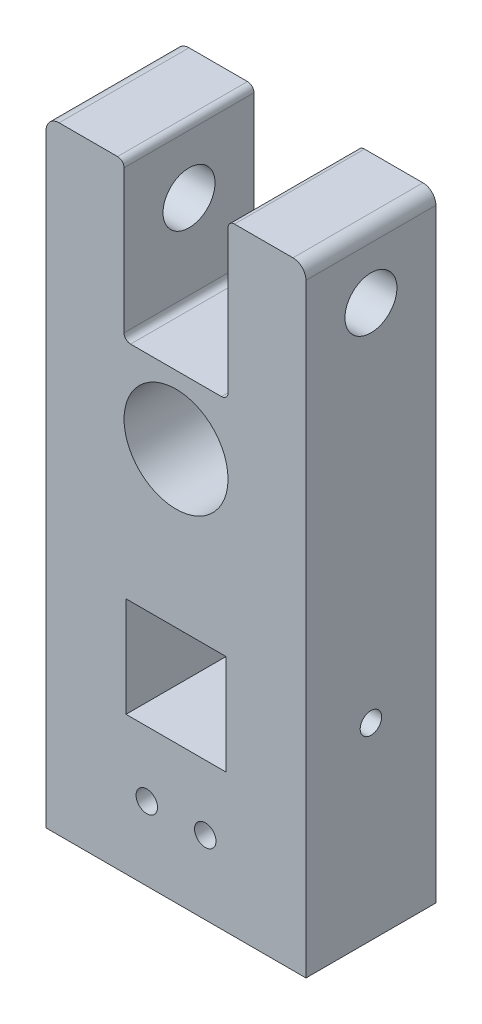
ISO-10303-21;
HEADER;
FILE_DESCRIPTION(('STEP AP214'),'2;1');
FILE_NAME('part.step','',(''),(''),'','','');
FILE_SCHEMA(('AUTOMOTIVE_DESIGN { 1 0 10303 214 1 1 1 1 }'));
ENDSEC;
DATA;
#1=APPLICATION_CONTEXT('core data for automotive mechanical design processes');
#2=APPLICATION_PROTOCOL_DEFINITION('international standard','automotive_design',2000,#1);
#3=PRODUCT_CONTEXT('',#1,'mechanical');
#4=PRODUCT('Part','Part','',(#3));
#5=PRODUCT_RELATED_PRODUCT_CATEGORY('part','',(#4));
#6=PRODUCT_DEFINITION_FORMATION('','',#4);
#7=PRODUCT_DEFINITION_CONTEXT('part definition',#1,'design');
#8=PRODUCT_DEFINITION('design','',#6,#7);
#9=PRODUCT_DEFINITION_SHAPE('','',#8);
#10=(LENGTH_UNIT() NAMED_UNIT(*) SI_UNIT(.MILLI.,.METRE.));
#11=(NAMED_UNIT(*) PLANE_ANGLE_UNIT() SI_UNIT($,.RADIAN.));
#12=(NAMED_UNIT(*) SI_UNIT($,.STERADIAN.) SOLID_ANGLE_UNIT());
#13=UNCERTAINTY_MEASURE_WITH_UNIT(LENGTH_MEASURE(1.E-05),#10,'distance_accuracy_value','');
#14=(GEOMETRIC_REPRESENTATION_CONTEXT(3) GLOBAL_UNCERTAINTY_ASSIGNED_CONTEXT((#13)) GLOBAL_UNIT_ASSIGNED_CONTEXT((#10,
#11,#12)) REPRESENTATION_CONTEXT('',''));
#15=CARTESIAN_POINT('',(0.,0.,0.));
#16=DIRECTION('',(0.,0.,1.));
#17=DIRECTION('',(1.,0.,0.));
#18=AXIS2_PLACEMENT_3D('',#15,#16,#17);
#19=CARTESIAN_POINT('',(-20.,34.5,20.));
#20=DIRECTION('',(0.,-1.,0.));
#21=DIRECTION('',(0.,0.,-1.));
#22=AXIS2_PLACEMENT_3D('',#19,#20,#21);
#23=PLANE('',#22);
#24=DIRECTION('',(-1.,0.,0.));
#25=VECTOR('',#24,1.);
#26=CARTESIAN_POINT('',(-20.,34.5,20.));
#27=LINE('',#26,#25);
#28=CARTESIAN_POINT('',(-8.99999999999999,34.5,20.));
#29=VERTEX_POINT('',#28);
#30=CARTESIAN_POINT('',(-18.,34.5,20.));
#31=VERTEX_POINT('',#30);
#32=EDGE_CURVE('E318',#29,#31,#27,.T.);
#33=ORIENTED_EDGE('',*,*,#32,.F.);
#34=DIRECTION('',(0.,0.,1.));
#35=VECTOR('',#34,1.);
#36=CARTESIAN_POINT('',(-8.99999999999999,34.5,20.));
#37=LINE('',#36,#35);
#38=CARTESIAN_POINT('',(-8.99999999999999,34.5,0.));
#39=VERTEX_POINT('',#38);
#40=EDGE_CURVE('E433',#29,#39,#37,.F.);
#41=ORIENTED_EDGE('',*,*,#40,.T.);
#42=DIRECTION('',(-1.,0.,0.));
#43=VECTOR('',#42,1.);
#44=CARTESIAN_POINT('',(-20.,34.5,0.));
#45=LINE('',#44,#43);
#46=CARTESIAN_POINT('',(-18.,34.5,0.));
#47=VERTEX_POINT('',#46);
#48=EDGE_CURVE('E331',#39,#47,#45,.T.);
#49=ORIENTED_EDGE('',*,*,#48,.T.);
#50=DIRECTION('',(0.,0.,-1.));
#51=VECTOR('',#50,1.);
#52=CARTESIAN_POINT('',(-18.,34.5,20.));
#53=LINE('',#52,#51);
#54=EDGE_CURVE('E355',#47,#31,#53,.F.);
#55=ORIENTED_EDGE('',*,*,#54,.T.);
#56=EDGE_LOOP('',(#33,#41,#49,#55));
#57=FACE_BOUND('',#56,.T.);
#58=ADVANCED_FACE('F44',(#57),#23,.F.);
#59=CARTESIAN_POINT('',(0.,0.,20.));
#60=DIRECTION('',(0.,0.,-1.));
#61=DIRECTION('',(-1.,0.,0.));
#62=AXIS2_PLACEMENT_3D('',#59,#60,#61);
#63=PLANE('',#62);
#64=CARTESIAN_POINT('',(0.,0.,20.));
#65=DIRECTION('',(0.,0.,1.));
#66=DIRECTION('',(1.,0.,0.));
#67=AXIS2_PLACEMENT_3D('',#64,#65,#66);
#68=CIRCLE('',#67,8.);
#69=CARTESIAN_POINT('',(8.,0.,20.));
#70=VERTEX_POINT('',#69);
#71=EDGE_CURVE('E310',#70,#70,#68,.T.);
#72=ORIENTED_EDGE('',*,*,#71,.F.);
#73=EDGE_LOOP('',(#72));
#74=FACE_BOUND('',#73,.T.);
#75=DIRECTION('',(-1.,0.,0.));
#76=VECTOR('',#75,1.);
#77=CARTESIAN_POINT('',(-7.69999999999999,-23.8,20.));
#78=LINE('',#77,#76);
#79=CARTESIAN_POINT('',(7.70000000000001,-23.8,20.));
#80=VERTEX_POINT('',#79);
#81=CARTESIAN_POINT('',(-7.69999999999999,-23.8,20.));
#82=VERTEX_POINT('',#81);
#83=EDGE_CURVE('E263',#80,#82,#78,.T.);
#84=ORIENTED_EDGE('',*,*,#83,.F.);
#85=DIRECTION('',(0.,1.,0.));
#86=VECTOR('',#85,1.);
#87=CARTESIAN_POINT('',(7.70000000000001,-39.2,20.));
#88=LINE('',#87,#86);
#89=CARTESIAN_POINT('',(7.70000000000001,-39.2,20.));
#90=VERTEX_POINT('',#89);
#91=EDGE_CURVE('E265',#90,#80,#88,.T.);
#92=ORIENTED_EDGE('',*,*,#91,.F.);
#93=DIRECTION('',(1.,0.,0.));
#94=VECTOR('',#93,1.);
#95=CARTESIAN_POINT('',(-7.69999999999999,-39.2,20.));
#96=LINE('',#95,#94);
#97=CARTESIAN_POINT('',(-7.69999999999999,-39.2,20.));
#98=VERTEX_POINT('',#97);
#99=EDGE_CURVE('E274',#98,#90,#96,.T.);
#100=ORIENTED_EDGE('',*,*,#99,.F.);
#101=DIRECTION('',(0.,-1.,0.));
#102=VECTOR('',#101,1.);
#103=CARTESIAN_POINT('',(-7.69999999999999,-39.2,20.));
#104=LINE('',#103,#102);
#105=EDGE_CURVE('E267',#82,#98,#104,.T.);
#106=ORIENTED_EDGE('',*,*,#105,.F.);
#107=EDGE_LOOP('',(#84,#92,#100,#106));
#108=FACE_BOUND('',#107,.T.);
#109=CARTESIAN_POINT('',(-4.49999999999999,-49.2,20.));
#110=DIRECTION('',(0.,0.,1.));
#111=DIRECTION('',(1.,0.,0.));
#112=AXIS2_PLACEMENT_3D('',#109,#110,#111);
#113=CIRCLE('',#112,1.65);
#114=CARTESIAN_POINT('',(-2.84999999999999,-49.2,20.));
#115=VERTEX_POINT('',#114);
#116=EDGE_CURVE('E247',#115,#115,#113,.T.);
#117=ORIENTED_EDGE('',*,*,#116,.F.);
#118=EDGE_LOOP('',(#117));
#119=FACE_BOUND('',#118,.T.);
#120=CARTESIAN_POINT('',(4.50000000000001,-49.2,20.));
#121=DIRECTION('',(0.,0.,1.));
#122=DIRECTION('',(1.,0.,0.));
#123=AXIS2_PLACEMENT_3D('',#120,#121,#122);
#124=CIRCLE('',#123,1.65);
#125=CARTESIAN_POINT('',(6.15000000000001,-49.2,20.));
#126=VERTEX_POINT('',#125);
#127=EDGE_CURVE('E251',#126,#126,#124,.T.);
#128=ORIENTED_EDGE('',*,*,#127,.F.);
#129=EDGE_LOOP('',(#128));
#130=FACE_BOUND('',#129,.T.);
#131=CARTESIAN_POINT('',(18.,34.5,20.));
#132=VERTEX_POINT('',#131);
#133=CARTESIAN_POINT('',(9.00000000000001,34.5,20.));
#134=VERTEX_POINT('',#133);
#135=EDGE_CURVE('E325',#132,#134,#27,.T.);
#136=ORIENTED_EDGE('',*,*,#135,.T.);
#137=CARTESIAN_POINT('',(9.00000000000001,33.5,20.));
#138=DIRECTION('',(0.,0.,-1.));
#139=DIRECTION('',(-1.,0.,0.));
#140=AXIS2_PLACEMENT_3D('',#137,#138,#139);
#141=CIRCLE('',#140,1.);
#142=CARTESIAN_POINT('',(8.00000000000001,33.5,20.));
#143=VERTEX_POINT('',#142);
#144=EDGE_CURVE('E407',#134,#143,#141,.F.);
#145=ORIENTED_EDGE('',*,*,#144,.T.);
#146=DIRECTION('',(0.,1.,0.));
#147=VECTOR('',#146,1.);
#148=CARTESIAN_POINT('',(8.00000000000001,10.5,20.));
#149=LINE('',#148,#147);
#150=CARTESIAN_POINT('',(8.00000000000001,11.5,20.));
#151=VERTEX_POINT('',#150);
#152=EDGE_CURVE('E465',#151,#143,#149,.T.);
#153=ORIENTED_EDGE('',*,*,#152,.F.);
#154=CARTESIAN_POINT('',(7.00000000000001,11.5,20.));
#155=DIRECTION('',(0.,0.,-1.));
#156=DIRECTION('',(-1.,0.,0.));
#157=AXIS2_PLACEMENT_3D('',#154,#155,#156);
#158=CIRCLE('',#157,1.);
#159=CARTESIAN_POINT('',(7.00000000000001,10.5,20.));
#160=VERTEX_POINT('',#159);
#161=EDGE_CURVE('E445',#151,#160,#158,.T.);
#162=ORIENTED_EDGE('',*,*,#161,.T.);
#163=DIRECTION('',(1.,0.,0.));
#164=VECTOR('',#163,1.);
#165=CARTESIAN_POINT('',(-7.99999999999999,10.5,20.));
#166=LINE('',#165,#164);
#167=CARTESIAN_POINT('',(-6.99999999999999,10.5,20.));
#168=VERTEX_POINT('',#167);
#169=EDGE_CURVE('E229',#168,#160,#166,.T.);
#170=ORIENTED_EDGE('',*,*,#169,.F.);
#171=CARTESIAN_POINT('',(-6.99999999999999,11.5,20.));
#172=DIRECTION('',(0.,0.,-1.));
#173=DIRECTION('',(-1.,0.,0.));
#174=AXIS2_PLACEMENT_3D('',#171,#172,#173);
#175=CIRCLE('',#174,1.);
#176=CARTESIAN_POINT('',(-7.99999999999999,11.5,20.));
#177=VERTEX_POINT('',#176);
#178=EDGE_CURVE('E54',#168,#177,#175,.T.);
#179=ORIENTED_EDGE('',*,*,#178,.T.);
#180=DIRECTION('',(0.,-1.,0.));
#181=VECTOR('',#180,1.);
#182=CARTESIAN_POINT('',(-7.99999999999999,10.5,20.));
#183=LINE('',#182,#181);
#184=CARTESIAN_POINT('',(-7.99999999999999,33.5,20.));
#185=VERTEX_POINT('',#184);
#186=EDGE_CURVE('E454',#185,#177,#183,.T.);
#187=ORIENTED_EDGE('',*,*,#186,.F.);
#188=CARTESIAN_POINT('',(-8.99999999999999,33.5,20.));
#189=DIRECTION('',(0.,0.,-1.));
#190=DIRECTION('',(-1.,0.,0.));
#191=AXIS2_PLACEMENT_3D('',#188,#189,#190);
#192=CIRCLE('',#191,1.);
#193=EDGE_CURVE('E410',#185,#29,#192,.F.);
#194=ORIENTED_EDGE('',*,*,#193,.T.);
#195=ORIENTED_EDGE('',*,*,#32,.T.);
#196=CARTESIAN_POINT('',(-18.,32.5,20.));
#197=DIRECTION('',(0.,0.,-1.));
#198=DIRECTION('',(-1.,0.,0.));
#199=AXIS2_PLACEMENT_3D('',#196,#197,#198);
#200=CIRCLE('',#199,2.);
#201=CARTESIAN_POINT('',(-20.,32.5,20.));
#202=VERTEX_POINT('',#201);
#203=EDGE_CURVE('E376',#31,#202,#200,.F.);
#204=ORIENTED_EDGE('',*,*,#203,.T.);
#205=DIRECTION('',(0.,-1.,0.));
#206=VECTOR('',#205,1.);
#207=CARTESIAN_POINT('',(-20.,-34.5,20.));
#208=LINE('',#207,#206);
#209=CARTESIAN_POINT('',(-20.,-60.5,20.));
#210=VERTEX_POINT('',#209);
#211=EDGE_CURVE('E327',#202,#210,#208,.T.);
#212=ORIENTED_EDGE('',*,*,#211,.T.);
#213=DIRECTION('',(-1.,0.,0.));
#214=VECTOR('',#213,1.);
#215=CARTESIAN_POINT('',(-20.,-60.5,20.));
#216=LINE('',#215,#214);
#217=CARTESIAN_POINT('',(20.,-60.5,20.));
#218=VERTEX_POINT('',#217);
#219=EDGE_CURVE('E294',#218,#210,#216,.T.);
#220=ORIENTED_EDGE('',*,*,#219,.F.);
#221=DIRECTION('',(0.,1.,0.));
#222=VECTOR('',#221,1.);
#223=CARTESIAN_POINT('',(20.,-34.5,20.));
#224=LINE('',#223,#222);
#225=CARTESIAN_POINT('',(20.,32.5,20.));
#226=VERTEX_POINT('',#225);
#227=EDGE_CURVE('E317',#218,#226,#224,.T.);
#228=ORIENTED_EDGE('',*,*,#227,.T.);
#229=CARTESIAN_POINT('',(18.,32.5,20.));
#230=DIRECTION('',(0.,0.,-1.));
#231=DIRECTION('',(-1.,0.,0.));
#232=AXIS2_PLACEMENT_3D('',#229,#230,#231);
#233=CIRCLE('',#232,2.);
#234=EDGE_CURVE('E378',#226,#132,#233,.F.);
#235=ORIENTED_EDGE('',*,*,#234,.T.);
#236=EDGE_LOOP('',(#136,#145,#153,#162,#170,#179,#187,#194,#195,#204,#212,#220,#228,#235));
#237=FACE_BOUND('',#236,.T.);
#238=ADVANCED_FACE('F451',(#74,#108,#119,#130,#237),#63,.F.);
#239=CARTESIAN_POINT('',(20.,-34.5,20.));
#240=DIRECTION('',(-1.,0.,0.));
#241=DIRECTION('',(0.,0.,1.));
#242=AXIS2_PLACEMENT_3D('',#239,#240,#241);
#243=PLANE('',#242);
#244=CARTESIAN_POINT('',(20.,-31.5,10.));
#245=DIRECTION('',(1.,0.,0.));
#246=DIRECTION('',(0.,0.,-1.));
#247=AXIS2_PLACEMENT_3D('',#244,#245,#246);
#248=CIRCLE('',#247,1.65);
#249=CARTESIAN_POINT('',(20.,-31.5,8.35));
#250=VERTEX_POINT('',#249);
#251=EDGE_CURVE('E500',#250,#250,#248,.T.);
#252=ORIENTED_EDGE('',*,*,#251,.F.);
#253=EDGE_LOOP('',(#252));
#254=FACE_BOUND('',#253,.T.);
#255=CARTESIAN_POINT('',(20.,24.5,10.));
#256=DIRECTION('',(1.,0.,0.));
#257=DIRECTION('',(0.,0.,-1.));
#258=AXIS2_PLACEMENT_3D('',#255,#256,#257);
#259=CIRCLE('',#258,4.);
#260=CARTESIAN_POINT('',(20.,24.5,6.));
#261=VERTEX_POINT('',#260);
#262=EDGE_CURVE('E401',#261,#261,#259,.T.);
#263=ORIENTED_EDGE('',*,*,#262,.F.);
#264=EDGE_LOOP('',(#263));
#265=FACE_BOUND('',#264,.T.);
#266=DIRECTION('',(0.,1.,0.));
#267=VECTOR('',#266,1.);
#268=CARTESIAN_POINT('',(20.,-34.5,0.));
#269=LINE('',#268,#267);
#270=CARTESIAN_POINT('',(20.,-60.5,0.));
#271=VERTEX_POINT('',#270);
#272=CARTESIAN_POINT('',(20.,32.5,0.));
#273=VERTEX_POINT('',#272);
#274=EDGE_CURVE('E315',#271,#273,#269,.T.);
#275=ORIENTED_EDGE('',*,*,#274,.T.);
#276=DIRECTION('',(0.,0.,-1.));
#277=VECTOR('',#276,1.);
#278=CARTESIAN_POINT('',(20.,32.5,20.));
#279=LINE('',#278,#277);
#280=EDGE_CURVE('E373',#273,#226,#279,.F.);
#281=ORIENTED_EDGE('',*,*,#280,.T.);
#282=ORIENTED_EDGE('',*,*,#227,.F.);
#283=DIRECTION('',(0.,0.,1.));
#284=VECTOR('',#283,1.);
#285=CARTESIAN_POINT('',(20.,-60.5,0.));
#286=LINE('',#285,#284);
#287=EDGE_CURVE('E285',#271,#218,#286,.T.);
#288=ORIENTED_EDGE('',*,*,#287,.F.);
#289=EDGE_LOOP('',(#275,#281,#282,#288));
#290=FACE_BOUND('',#289,.T.);
#291=ADVANCED_FACE('F575',(#254,#265,#290),#243,.F.);
#292=CARTESIAN_POINT('',(18.,34.5,0.));
#293=VERTEX_POINT('',#292);
#294=CARTESIAN_POINT('',(9.00000000000001,34.5,0.));
#295=VERTEX_POINT('',#294);
#296=EDGE_CURVE('E334',#293,#295,#45,.T.);
#297=ORIENTED_EDGE('',*,*,#296,.T.);
#298=DIRECTION('',(0.,0.,1.));
#299=VECTOR('',#298,1.);
#300=CARTESIAN_POINT('',(9.00000000000001,34.5,20.));
#301=LINE('',#300,#299);
#302=EDGE_CURVE('E400',#295,#134,#301,.T.);
#303=ORIENTED_EDGE('',*,*,#302,.T.);
#304=ORIENTED_EDGE('',*,*,#135,.F.);
#305=DIRECTION('',(0.,0.,-1.));
#306=VECTOR('',#305,1.);
#307=CARTESIAN_POINT('',(18.,34.5,20.));
#308=LINE('',#307,#306);
#309=EDGE_CURVE('E365',#132,#293,#308,.T.);
#310=ORIENTED_EDGE('',*,*,#309,.T.);
#311=EDGE_LOOP('',(#297,#303,#304,#310));
#312=FACE_BOUND('',#311,.T.);
#313=ADVANCED_FACE('F519',(#312),#23,.F.);
#314=CARTESIAN_POINT('',(-20.,-34.5,20.));
#315=DIRECTION('',(1.,0.,0.));
#316=DIRECTION('',(0.,0.,-1.));
#317=AXIS2_PLACEMENT_3D('',#314,#315,#316);
#318=PLANE('',#317);
#319=CARTESIAN_POINT('',(-20.,-31.5,10.));
#320=DIRECTION('',(1.,0.,0.));
#321=DIRECTION('',(0.,0.,-1.));
#322=AXIS2_PLACEMENT_3D('',#319,#320,#321);
#323=CIRCLE('',#322,1.65);
#324=CARTESIAN_POINT('',(-20.,-31.5,8.35));
#325=VERTEX_POINT('',#324);
#326=EDGE_CURVE('E490',#325,#325,#323,.T.);
#327=ORIENTED_EDGE('',*,*,#326,.T.);
#328=EDGE_LOOP('',(#327));
#329=FACE_BOUND('',#328,.T.);
#330=CARTESIAN_POINT('',(-20.,24.5,10.));
#331=DIRECTION('',(1.,0.,0.));
#332=DIRECTION('',(0.,0.,-1.));
#333=AXIS2_PLACEMENT_3D('',#330,#331,#332);
#334=CIRCLE('',#333,4.);
#335=CARTESIAN_POINT('',(-20.,24.5,6.));
#336=VERTEX_POINT('',#335);
#337=EDGE_CURVE('E480',#336,#336,#334,.T.);
#338=ORIENTED_EDGE('',*,*,#337,.T.);
#339=EDGE_LOOP('',(#338));
#340=FACE_BOUND('',#339,.T.);
#341=ORIENTED_EDGE('',*,*,#211,.F.);
#342=DIRECTION('',(0.,0.,-1.));
#343=VECTOR('',#342,1.);
#344=CARTESIAN_POINT('',(-20.,32.5,20.));
#345=LINE('',#344,#343);
#346=CARTESIAN_POINT('',(-20.,32.5,0.));
#347=VERTEX_POINT('',#346);
#348=EDGE_CURVE('E385',#202,#347,#345,.T.);
#349=ORIENTED_EDGE('',*,*,#348,.T.);
#350=DIRECTION('',(0.,-1.,0.));
#351=VECTOR('',#350,1.);
#352=CARTESIAN_POINT('',(-20.,-34.5,0.));
#353=LINE('',#352,#351);
#354=CARTESIAN_POINT('',(-20.,-60.5,0.));
#355=VERTEX_POINT('',#354);
#356=EDGE_CURVE('E323',#347,#355,#353,.T.);
#357=ORIENTED_EDGE('',*,*,#356,.T.);
#358=DIRECTION('',(0.,0.,-1.));
#359=VECTOR('',#358,1.);
#360=CARTESIAN_POINT('',(-20.,-60.5,0.));
#361=LINE('',#360,#359);
#362=EDGE_CURVE('E299',#210,#355,#361,.T.);
#363=ORIENTED_EDGE('',*,*,#362,.F.);
#364=EDGE_LOOP('',(#341,#349,#357,#363));
#365=FACE_BOUND('',#364,.T.);
#366=ADVANCED_FACE('F518',(#329,#340,#365),#318,.F.);
#367=CARTESIAN_POINT('',(0.,0.,0.));
#368=DIRECTION('',(0.,0.,-1.));
#369=DIRECTION('',(-1.,0.,0.));
#370=AXIS2_PLACEMENT_3D('',#367,#368,#369);
#371=PLANE('',#370);
#372=DIRECTION('',(0.,-1.,0.));
#373=VECTOR('',#372,1.);
#374=CARTESIAN_POINT('',(8.00000000000001,0.,0.));
#375=LINE('',#374,#373);
#376=CARTESIAN_POINT('',(8.00000000000001,33.5,0.));
#377=VERTEX_POINT('',#376);
#378=CARTESIAN_POINT('',(8.00000000000001,11.5,0.));
#379=VERTEX_POINT('',#378);
#380=EDGE_CURVE('E394',#377,#379,#375,.T.);
#381=ORIENTED_EDGE('',*,*,#380,.F.);
#382=CARTESIAN_POINT('',(9.00000000000001,33.5,0.));
#383=DIRECTION('',(0.,0.,-1.));
#384=DIRECTION('',(-1.,0.,0.));
#385=AXIS2_PLACEMENT_3D('',#382,#383,#384);
#386=CIRCLE('',#385,1.);
#387=EDGE_CURVE('E421',#377,#295,#386,.T.);
#388=ORIENTED_EDGE('',*,*,#387,.T.);
#389=ORIENTED_EDGE('',*,*,#296,.F.);
#390=CARTESIAN_POINT('',(18.,32.5,0.));
#391=DIRECTION('',(0.,0.,-1.));
#392=DIRECTION('',(-1.,0.,0.));
#393=AXIS2_PLACEMENT_3D('',#390,#391,#392);
#394=CIRCLE('',#393,2.);
#395=EDGE_CURVE('E369',#293,#273,#394,.T.);
#396=ORIENTED_EDGE('',*,*,#395,.T.);
#397=ORIENTED_EDGE('',*,*,#274,.F.);
#398=DIRECTION('',(1.,0.,0.));
#399=VECTOR('',#398,1.);
#400=CARTESIAN_POINT('',(-20.,-60.5,0.));
#401=LINE('',#400,#399);
#402=EDGE_CURVE('E303',#355,#271,#401,.T.);
#403=ORIENTED_EDGE('',*,*,#402,.F.);
#404=ORIENTED_EDGE('',*,*,#356,.F.);
#405=CARTESIAN_POINT('',(-18.,32.5,0.));
#406=DIRECTION('',(0.,0.,-1.));
#407=DIRECTION('',(-1.,0.,0.));
#408=AXIS2_PLACEMENT_3D('',#405,#406,#407);
#409=CIRCLE('',#408,2.);
#410=EDGE_CURVE('E366',#347,#47,#409,.T.);
#411=ORIENTED_EDGE('',*,*,#410,.T.);
#412=ORIENTED_EDGE('',*,*,#48,.F.);
#413=CARTESIAN_POINT('',(-8.99999999999999,33.5,0.));
#414=DIRECTION('',(0.,0.,-1.));
#415=DIRECTION('',(-1.,0.,0.));
#416=AXIS2_PLACEMENT_3D('',#413,#414,#415);
#417=CIRCLE('',#416,1.);
#418=CARTESIAN_POINT('',(-7.99999999999999,33.5,0.));
#419=VERTEX_POINT('',#418);
#420=EDGE_CURVE('E417',#39,#419,#417,.T.);
#421=ORIENTED_EDGE('',*,*,#420,.T.);
#422=DIRECTION('',(0.,1.,0.));
#423=VECTOR('',#422,1.);
#424=CARTESIAN_POINT('',(-7.99999999999999,0.,0.));
#425=LINE('',#424,#423);
#426=CARTESIAN_POINT('',(-7.99999999999999,11.5,0.));
#427=VERTEX_POINT('',#426);
#428=EDGE_CURVE('E388',#427,#419,#425,.T.);
#429=ORIENTED_EDGE('',*,*,#428,.F.);
#430=CARTESIAN_POINT('',(-6.99999999999999,11.5,0.));
#431=DIRECTION('',(0.,0.,-1.));
#432=DIRECTION('',(-1.,0.,0.));
#433=AXIS2_PLACEMENT_3D('',#430,#431,#432);
#434=CIRCLE('',#433,1.);
#435=CARTESIAN_POINT('',(-6.99999999999999,10.5,0.));
#436=VERTEX_POINT('',#435);
#437=EDGE_CURVE('E11',#427,#436,#434,.F.);
#438=ORIENTED_EDGE('',*,*,#437,.T.);
#439=DIRECTION('',(-1.,0.,0.));
#440=VECTOR('',#439,1.);
#441=CARTESIAN_POINT('',(0.,10.5,0.));
#442=LINE('',#441,#440);
#443=CARTESIAN_POINT('',(7.00000000000001,10.5,0.));
#444=VERTEX_POINT('',#443);
#445=EDGE_CURVE('E387',#444,#436,#442,.T.);
#446=ORIENTED_EDGE('',*,*,#445,.F.);
#447=CARTESIAN_POINT('',(7.00000000000001,11.5,0.));
#448=DIRECTION('',(0.,0.,-1.));
#449=DIRECTION('',(-1.,0.,0.));
#450=AXIS2_PLACEMENT_3D('',#447,#448,#449);
#451=CIRCLE('',#450,1.);
#452=EDGE_CURVE('E444',#444,#379,#451,.F.);
#453=ORIENTED_EDGE('',*,*,#452,.T.);
#454=EDGE_LOOP('',(#381,#388,#389,#396,#397,#403,#404,#411,#412,#421,#429,#438,#446,#453));
#455=FACE_BOUND('',#454,.T.);
#456=CARTESIAN_POINT('',(4.50000000000001,-49.2,0.));
#457=DIRECTION('',(0.,0.,-1.));
#458=DIRECTION('',(-1.,0.,0.));
#459=AXIS2_PLACEMENT_3D('',#456,#457,#458);
#460=CIRCLE('',#459,1.65);
#461=CARTESIAN_POINT('',(2.85000000000001,-49.2,0.));
#462=VERTEX_POINT('',#461);
#463=EDGE_CURVE('E268',#462,#462,#460,.T.);
#464=ORIENTED_EDGE('',*,*,#463,.F.);
#465=EDGE_LOOP('',(#464));
#466=FACE_BOUND('',#465,.T.);
#467=CARTESIAN_POINT('',(-4.49999999999999,-49.2,0.));
#468=DIRECTION('',(0.,0.,-1.));
#469=DIRECTION('',(-1.,0.,0.));
#470=AXIS2_PLACEMENT_3D('',#467,#468,#469);
#471=CIRCLE('',#470,1.65);
#472=CARTESIAN_POINT('',(-6.14999999999999,-49.2,0.));
#473=VERTEX_POINT('',#472);
#474=EDGE_CURVE('E256',#473,#473,#471,.T.);
#475=ORIENTED_EDGE('',*,*,#474,.F.);
#476=EDGE_LOOP('',(#475));
#477=FACE_BOUND('',#476,.T.);
#478=DIRECTION('',(0.,-1.,0.));
#479=VECTOR('',#478,1.);
#480=CARTESIAN_POINT('',(7.70000000000001,0.,0.));
#481=LINE('',#480,#479);
#482=CARTESIAN_POINT('',(7.70000000000001,-23.8,0.));
#483=VERTEX_POINT('',#482);
#484=CARTESIAN_POINT('',(7.70000000000001,-39.2,0.));
#485=VERTEX_POINT('',#484);
#486=EDGE_CURVE('E346',#483,#485,#481,.T.);
#487=ORIENTED_EDGE('',*,*,#486,.F.);
#488=DIRECTION('',(1.,0.,0.));
#489=VECTOR('',#488,1.);
#490=CARTESIAN_POINT('',(0.,-23.8,0.));
#491=LINE('',#490,#489);
#492=CARTESIAN_POINT('',(-7.69999999999999,-23.8,0.));
#493=VERTEX_POINT('',#492);
#494=EDGE_CURVE('E326',#493,#483,#491,.T.);
#495=ORIENTED_EDGE('',*,*,#494,.F.);
#496=DIRECTION('',(0.,1.,0.));
#497=VECTOR('',#496,1.);
#498=CARTESIAN_POINT('',(-7.69999999999999,0.,0.));
#499=LINE('',#498,#497);
#500=CARTESIAN_POINT('',(-7.69999999999999,-39.2,0.));
#501=VERTEX_POINT('',#500);
#502=EDGE_CURVE('E345',#501,#493,#499,.T.);
#503=ORIENTED_EDGE('',*,*,#502,.F.);
#504=DIRECTION('',(-1.,0.,0.));
#505=VECTOR('',#504,1.);
#506=CARTESIAN_POINT('',(0.,-39.2,0.));
#507=LINE('',#506,#505);
#508=EDGE_CURVE('E347',#485,#501,#507,.T.);
#509=ORIENTED_EDGE('',*,*,#508,.F.);
#510=EDGE_LOOP('',(#487,#495,#503,#509));
#511=FACE_BOUND('',#510,.T.);
#512=CARTESIAN_POINT('',(0.,0.,0.));
#513=DIRECTION('',(0.,0.,1.));
#514=DIRECTION('',(1.,0.,0.));
#515=AXIS2_PLACEMENT_3D('',#512,#513,#514);
#516=CIRCLE('',#515,8.);
#517=CARTESIAN_POINT('',(8.,0.,0.));
#518=VERTEX_POINT('',#517);
#519=EDGE_CURVE('E308',#518,#518,#516,.T.);
#520=ORIENTED_EDGE('',*,*,#519,.T.);
#521=EDGE_LOOP('',(#520));
#522=FACE_BOUND('',#521,.T.);
#523=ADVANCED_FACE('F467',(#455,#466,#477,#511,#522),#371,.T.);
#524=CARTESIAN_POINT('',(0.,0.,0.));
#525=DIRECTION('',(0.,0.,1.));
#526=DIRECTION('',(1.,0.,0.));
#527=AXIS2_PLACEMENT_3D('',#524,#525,#526);
#528=CYLINDRICAL_SURFACE('',#527,8.);
#529=ORIENTED_EDGE('',*,*,#519,.F.);
#530=EDGE_LOOP('',(#529));
#531=FACE_BOUND('',#530,.T.);
#532=ORIENTED_EDGE('',*,*,#71,.T.);
#533=EDGE_LOOP('',(#532));
#534=FACE_BOUND('',#533,.T.);
#535=ADVANCED_FACE('F639',(#531,#534),#528,.F.);
#536=CARTESIAN_POINT('',(0.,-60.5,0.));
#537=DIRECTION('',(0.,1.,0.));
#538=DIRECTION('',(0.,0.,1.));
#539=AXIS2_PLACEMENT_3D('',#536,#537,#538);
#540=PLANE('',#539);
#541=DIRECTION('',(-1.,0.,0.));
#542=VECTOR('',#541,1.);
#543=CARTESIAN_POINT('',(-2.5,-60.5,14.5));
#544=LINE('',#543,#542);
#545=CARTESIAN_POINT('',(2.5,-60.5,14.5));
#546=VERTEX_POINT('',#545);
#547=CARTESIAN_POINT('',(-2.5,-60.5,14.5));
#548=VERTEX_POINT('',#547);
#549=EDGE_CURVE('E237',#546,#548,#544,.T.);
#550=ORIENTED_EDGE('',*,*,#549,.F.);
#551=DIRECTION('',(0.,0.,1.));
#552=VECTOR('',#551,1.);
#553=CARTESIAN_POINT('',(2.5,-60.5,9.5));
#554=LINE('',#553,#552);
#555=CARTESIAN_POINT('',(2.5,-60.5,9.5));
#556=VERTEX_POINT('',#555);
#557=EDGE_CURVE('E201',#556,#546,#554,.T.);
#558=ORIENTED_EDGE('',*,*,#557,.F.);
#559=DIRECTION('',(1.,0.,0.));
#560=VECTOR('',#559,1.);
#561=CARTESIAN_POINT('',(-2.5,-60.5,9.5));
#562=LINE('',#561,#560);
#563=CARTESIAN_POINT('',(-2.5,-60.5,9.5));
#564=VERTEX_POINT('',#563);
#565=EDGE_CURVE('E221',#564,#556,#562,.T.);
#566=ORIENTED_EDGE('',*,*,#565,.F.);
#567=DIRECTION('',(0.,0.,-1.));
#568=VECTOR('',#567,1.);
#569=CARTESIAN_POINT('',(-2.5,-60.5,9.5));
#570=LINE('',#569,#568);
#571=EDGE_CURVE('E227',#548,#564,#570,.T.);
#572=ORIENTED_EDGE('',*,*,#571,.F.);
#573=EDGE_LOOP('',(#550,#558,#566,#572));
#574=FACE_BOUND('',#573,.T.);
#575=ORIENTED_EDGE('',*,*,#287,.T.);
#576=ORIENTED_EDGE('',*,*,#219,.T.);
#577=ORIENTED_EDGE('',*,*,#362,.T.);
#578=ORIENTED_EDGE('',*,*,#402,.T.);
#579=EDGE_LOOP('',(#575,#576,#577,#578));
#580=FACE_BOUND('',#579,.T.);
#581=ADVANCED_FACE('F538',(#574,#580),#540,.F.);
#582=CARTESIAN_POINT('',(7.70000000000001,-39.2,-80.));
#583=DIRECTION('',(1.,0.,0.));
#584=DIRECTION('',(0.,0.,-1.));
#585=AXIS2_PLACEMENT_3D('',#582,#583,#584);
#586=PLANE('',#585);
#587=CARTESIAN_POINT('',(7.70000000000004,-31.5,10.));
#588=DIRECTION('',(1.,0.,0.));
#589=DIRECTION('',(0.,0.,-1.));
#590=AXIS2_PLACEMENT_3D('',#587,#588,#589);
#591=CIRCLE('',#590,1.65);
#592=CARTESIAN_POINT('',(7.70000000000004,-31.5,8.35));
#593=VERTEX_POINT('',#592);
#594=EDGE_CURVE('E491',#593,#593,#591,.T.);
#595=ORIENTED_EDGE('',*,*,#594,.T.);
#596=EDGE_LOOP('',(#595));
#597=FACE_BOUND('',#596,.T.);
#598=ORIENTED_EDGE('',*,*,#486,.T.);
#599=DIRECTION('',(0.,0.,1.));
#600=VECTOR('',#599,1.);
#601=CARTESIAN_POINT('',(7.70000000000001,-39.2,-80.));
#602=LINE('',#601,#600);
#603=EDGE_CURVE('E279',#485,#90,#602,.T.);
#604=ORIENTED_EDGE('',*,*,#603,.T.);
#605=ORIENTED_EDGE('',*,*,#91,.T.);
#606=DIRECTION('',(0.,0.,1.));
#607=VECTOR('',#606,1.);
#608=CARTESIAN_POINT('',(7.70000000000001,-23.8,-80.));
#609=LINE('',#608,#607);
#610=EDGE_CURVE('E276',#483,#80,#609,.T.);
#611=ORIENTED_EDGE('',*,*,#610,.F.);
#612=EDGE_LOOP('',(#598,#604,#605,#611));
#613=FACE_BOUND('',#612,.T.);
#614=ADVANCED_FACE('F628',(#597,#613),#586,.F.);
#615=CARTESIAN_POINT('',(-7.69999999999999,-39.2,-80.));
#616=DIRECTION('',(0.,-1.,0.));
#617=DIRECTION('',(0.,0.,-1.));
#618=AXIS2_PLACEMENT_3D('',#615,#616,#617);
#619=PLANE('',#618);
#620=ORIENTED_EDGE('',*,*,#508,.T.);
#621=DIRECTION('',(0.,0.,1.));
#622=VECTOR('',#621,1.);
#623=CARTESIAN_POINT('',(-7.69999999999999,-39.2,-80.));
#624=LINE('',#623,#622);
#625=EDGE_CURVE('E284',#501,#98,#624,.T.);
#626=ORIENTED_EDGE('',*,*,#625,.T.);
#627=ORIENTED_EDGE('',*,*,#99,.T.);
#628=ORIENTED_EDGE('',*,*,#603,.F.);
#629=EDGE_LOOP('',(#620,#626,#627,#628));
#630=FACE_BOUND('',#629,.T.);
#631=ADVANCED_FACE('F622',(#630),#619,.F.);
#632=CARTESIAN_POINT('',(-7.69999999999999,-39.2,-80.));
#633=DIRECTION('',(-1.,0.,0.));
#634=DIRECTION('',(0.,0.,1.));
#635=AXIS2_PLACEMENT_3D('',#632,#633,#634);
#636=PLANE('',#635);
#637=CARTESIAN_POINT('',(-7.70000000000004,-31.5,10.));
#638=DIRECTION('',(-1.,0.,0.));
#639=DIRECTION('',(0.,0.,1.));
#640=AXIS2_PLACEMENT_3D('',#637,#638,#639);
#641=CIRCLE('',#640,1.65);
#642=CARTESIAN_POINT('',(-7.70000000000004,-31.5,11.65));
#643=VERTEX_POINT('',#642);
#644=EDGE_CURVE('E47',#643,#643,#641,.T.);
#645=ORIENTED_EDGE('',*,*,#644,.T.);
#646=EDGE_LOOP('',(#645));
#647=FACE_BOUND('',#646,.T.);
#648=ORIENTED_EDGE('',*,*,#502,.T.);
#649=DIRECTION('',(0.,0.,1.));
#650=VECTOR('',#649,1.);
#651=CARTESIAN_POINT('',(-7.69999999999999,-23.8,-80.));
#652=LINE('',#651,#650);
#653=EDGE_CURVE('E288',#493,#82,#652,.T.);
#654=ORIENTED_EDGE('',*,*,#653,.T.);
#655=ORIENTED_EDGE('',*,*,#105,.T.);
#656=ORIENTED_EDGE('',*,*,#625,.F.);
#657=EDGE_LOOP('',(#648,#654,#655,#656));
#658=FACE_BOUND('',#657,.T.);
#659=ADVANCED_FACE('F506',(#647,#658),#636,.F.);
#660=CARTESIAN_POINT('',(-7.69999999999999,-23.8,-80.));
#661=DIRECTION('',(0.,1.,0.));
#662=DIRECTION('',(0.,0.,1.));
#663=AXIS2_PLACEMENT_3D('',#660,#661,#662);
#664=PLANE('',#663);
#665=ORIENTED_EDGE('',*,*,#494,.T.);
#666=ORIENTED_EDGE('',*,*,#610,.T.);
#667=ORIENTED_EDGE('',*,*,#83,.T.);
#668=ORIENTED_EDGE('',*,*,#653,.F.);
#669=EDGE_LOOP('',(#665,#666,#667,#668));
#670=FACE_BOUND('',#669,.T.);
#671=ADVANCED_FACE('F621',(#670),#664,.F.);
#672=CARTESIAN_POINT('',(-4.49999999999999,-49.2,-20.));
#673=DIRECTION('',(0.,0.,1.));
#674=DIRECTION('',(1.,0.,0.));
#675=AXIS2_PLACEMENT_3D('',#672,#673,#674);
#676=CYLINDRICAL_SURFACE('',#675,1.65);
#677=ORIENTED_EDGE('',*,*,#474,.T.);
#678=EDGE_LOOP('',(#677));
#679=FACE_BOUND('',#678,.T.);
#680=ORIENTED_EDGE('',*,*,#116,.T.);
#681=EDGE_LOOP('',(#680));
#682=FACE_BOUND('',#681,.T.);
#683=ADVANCED_FACE('F620',(#679,#682),#676,.F.);
#684=CARTESIAN_POINT('',(4.50000000000001,-49.2,-20.));
#685=DIRECTION('',(0.,0.,1.));
#686=DIRECTION('',(1.,0.,0.));
#687=AXIS2_PLACEMENT_3D('',#684,#685,#686);
#688=CYLINDRICAL_SURFACE('',#687,1.65);
#689=ORIENTED_EDGE('',*,*,#463,.T.);
#690=EDGE_LOOP('',(#689));
#691=FACE_BOUND('',#690,.T.);
#692=ORIENTED_EDGE('',*,*,#127,.T.);
#693=EDGE_LOOP('',(#692));
#694=FACE_BOUND('',#693,.T.);
#695=ADVANCED_FACE('F618',(#691,#694),#688,.F.);
#696=CARTESIAN_POINT('',(2.5,-54.5,9.5));
#697=DIRECTION('',(1.,0.,0.));
#698=DIRECTION('',(0.,0.,-1.));
#699=AXIS2_PLACEMENT_3D('',#696,#697,#698);
#700=PLANE('',#699);
#701=ORIENTED_EDGE('',*,*,#557,.T.);
#702=DIRECTION('',(0.,-1.,0.));
#703=VECTOR('',#702,1.);
#704=CARTESIAN_POINT('',(2.5,-54.5,14.5));
#705=LINE('',#704,#703);
#706=CARTESIAN_POINT('',(2.5,-54.5,14.5));
#707=VERTEX_POINT('',#706);
#708=EDGE_CURVE('E197',#707,#546,#705,.T.);
#709=ORIENTED_EDGE('',*,*,#708,.F.);
#710=DIRECTION('',(0.,0.,1.));
#711=VECTOR('',#710,1.);
#712=CARTESIAN_POINT('',(2.5,-54.5,9.5));
#713=LINE('',#712,#711);
#714=CARTESIAN_POINT('',(2.5,-54.5,9.5));
#715=VERTEX_POINT('',#714);
#716=EDGE_CURVE('E198',#715,#707,#713,.T.);
#717=ORIENTED_EDGE('',*,*,#716,.F.);
#718=DIRECTION('',(0.,-1.,0.));
#719=VECTOR('',#718,1.);
#720=CARTESIAN_POINT('',(2.5,-54.5,9.5));
#721=LINE('',#720,#719);
#722=EDGE_CURVE('E244',#715,#556,#721,.T.);
#723=ORIENTED_EDGE('',*,*,#722,.T.);
#724=EDGE_LOOP('',(#701,#709,#717,#723));
#725=FACE_BOUND('',#724,.T.);
#726=ADVANCED_FACE('F199',(#725),#700,.F.);
#727=CARTESIAN_POINT('',(-2.5,-54.5,9.5));
#728=DIRECTION('',(0.,0.,-1.));
#729=DIRECTION('',(-1.,0.,0.));
#730=AXIS2_PLACEMENT_3D('',#727,#728,#729);
#731=PLANE('',#730);
#732=ORIENTED_EDGE('',*,*,#565,.T.);
#733=ORIENTED_EDGE('',*,*,#722,.F.);
#734=DIRECTION('',(1.,0.,0.));
#735=VECTOR('',#734,1.);
#736=CARTESIAN_POINT('',(-2.5,-54.5,9.5));
#737=LINE('',#736,#735);
#738=CARTESIAN_POINT('',(-2.5,-54.5,9.5));
#739=VERTEX_POINT('',#738);
#740=EDGE_CURVE('E209',#739,#715,#737,.T.);
#741=ORIENTED_EDGE('',*,*,#740,.F.);
#742=DIRECTION('',(0.,-1.,0.));
#743=VECTOR('',#742,1.);
#744=CARTESIAN_POINT('',(-2.5,-54.5,9.5));
#745=LINE('',#744,#743);
#746=EDGE_CURVE('E248',#739,#564,#745,.T.);
#747=ORIENTED_EDGE('',*,*,#746,.T.);
#748=EDGE_LOOP('',(#732,#733,#741,#747));
#749=FACE_BOUND('',#748,.T.);
#750=ADVANCED_FACE('F604',(#749),#731,.F.);
#751=CARTESIAN_POINT('',(-2.5,-54.5,9.5));
#752=DIRECTION('',(-1.,0.,0.));
#753=DIRECTION('',(0.,0.,1.));
#754=AXIS2_PLACEMENT_3D('',#751,#752,#753);
#755=PLANE('',#754);
#756=ORIENTED_EDGE('',*,*,#571,.T.);
#757=ORIENTED_EDGE('',*,*,#746,.F.);
#758=DIRECTION('',(0.,0.,-1.));
#759=VECTOR('',#758,1.);
#760=CARTESIAN_POINT('',(-2.5,-54.5,9.5));
#761=LINE('',#760,#759);
#762=CARTESIAN_POINT('',(-2.5,-54.5,14.5));
#763=VERTEX_POINT('',#762);
#764=EDGE_CURVE('E219',#763,#739,#761,.T.);
#765=ORIENTED_EDGE('',*,*,#764,.F.);
#766=DIRECTION('',(0.,-1.,0.));
#767=VECTOR('',#766,1.);
#768=CARTESIAN_POINT('',(-2.5,-54.5,14.5));
#769=LINE('',#768,#767);
#770=EDGE_CURVE('E206',#763,#548,#769,.T.);
#771=ORIENTED_EDGE('',*,*,#770,.T.);
#772=EDGE_LOOP('',(#756,#757,#765,#771));
#773=FACE_BOUND('',#772,.T.);
#774=ADVANCED_FACE('F610',(#773),#755,.F.);
#775=CARTESIAN_POINT('',(-2.5,-54.5,14.5));
#776=DIRECTION('',(0.,0.,1.));
#777=DIRECTION('',(1.,0.,0.));
#778=AXIS2_PLACEMENT_3D('',#775,#776,#777);
#779=PLANE('',#778);
#780=ORIENTED_EDGE('',*,*,#549,.T.);
#781=ORIENTED_EDGE('',*,*,#770,.F.);
#782=DIRECTION('',(-1.,0.,0.));
#783=VECTOR('',#782,1.);
#784=CARTESIAN_POINT('',(-2.5,-54.5,14.5));
#785=LINE('',#784,#783);
#786=EDGE_CURVE('E215',#707,#763,#785,.T.);
#787=ORIENTED_EDGE('',*,*,#786,.F.);
#788=ORIENTED_EDGE('',*,*,#708,.T.);
#789=EDGE_LOOP('',(#780,#781,#787,#788));
#790=FACE_BOUND('',#789,.T.);
#791=ADVANCED_FACE('F211',(#790),#779,.F.);
#792=CARTESIAN_POINT('',(0.,-54.5,0.));
#793=DIRECTION('',(0.,1.,0.));
#794=DIRECTION('',(0.,0.,1.));
#795=AXIS2_PLACEMENT_3D('',#792,#793,#794);
#796=PLANE('',#795);
#797=ORIENTED_EDGE('',*,*,#716,.T.);
#798=ORIENTED_EDGE('',*,*,#786,.T.);
#799=ORIENTED_EDGE('',*,*,#764,.T.);
#800=ORIENTED_EDGE('',*,*,#740,.T.);
#801=EDGE_LOOP('',(#797,#798,#799,#800));
#802=FACE_BOUND('',#801,.T.);
#803=ADVANCED_FACE('F218',(#802),#796,.F.);
#804=CARTESIAN_POINT('',(18.,32.5,20.));
#805=DIRECTION('',(0.,0.,-1.));
#806=DIRECTION('',(-1.,0.,0.));
#807=AXIS2_PLACEMENT_3D('',#804,#805,#806);
#808=CYLINDRICAL_SURFACE('',#807,2.);
#809=ORIENTED_EDGE('',*,*,#234,.F.);
#810=ORIENTED_EDGE('',*,*,#280,.F.);
#811=ORIENTED_EDGE('',*,*,#395,.F.);
#812=ORIENTED_EDGE('',*,*,#309,.F.);
#813=EDGE_LOOP('',(#809,#810,#811,#812));
#814=FACE_BOUND('',#813,.T.);
#815=ADVANCED_FACE('F541',(#814),#808,.T.);
#816=CARTESIAN_POINT('',(-18.,32.5,20.));
#817=DIRECTION('',(0.,0.,-1.));
#818=DIRECTION('',(-1.,0.,0.));
#819=AXIS2_PLACEMENT_3D('',#816,#817,#818);
#820=CYLINDRICAL_SURFACE('',#819,2.);
#821=ORIENTED_EDGE('',*,*,#203,.F.);
#822=ORIENTED_EDGE('',*,*,#54,.F.);
#823=ORIENTED_EDGE('',*,*,#410,.F.);
#824=ORIENTED_EDGE('',*,*,#348,.F.);
#825=EDGE_LOOP('',(#821,#822,#823,#824));
#826=FACE_BOUND('',#825,.T.);
#827=ADVANCED_FACE('F527',(#826),#820,.T.);
#828=CARTESIAN_POINT('',(8.00000000000001,10.5,-30.));
#829=DIRECTION('',(1.,0.,0.));
#830=DIRECTION('',(0.,0.,-1.));
#831=AXIS2_PLACEMENT_3D('',#828,#829,#830);
#832=PLANE('',#831);
#833=CARTESIAN_POINT('',(8.00000000000001,24.5,10.));
#834=DIRECTION('',(1.,0.,0.));
#835=DIRECTION('',(0.,0.,-1.));
#836=AXIS2_PLACEMENT_3D('',#833,#834,#835);
#837=CIRCLE('',#836,4.);
#838=CARTESIAN_POINT('',(8.00000000000001,24.5,6.));
#839=VERTEX_POINT('',#838);
#840=EDGE_CURVE('E405',#839,#839,#837,.T.);
#841=ORIENTED_EDGE('',*,*,#840,.T.);
#842=EDGE_LOOP('',(#841));
#843=FACE_BOUND('',#842,.T.);
#844=ORIENTED_EDGE('',*,*,#152,.T.);
#845=DIRECTION('',(0.,0.,1.));
#846=VECTOR('',#845,1.);
#847=CARTESIAN_POINT('',(8.00000000000001,33.5,-30.));
#848=LINE('',#847,#846);
#849=EDGE_CURVE('E420',#143,#377,#848,.F.);
#850=ORIENTED_EDGE('',*,*,#849,.T.);
#851=ORIENTED_EDGE('',*,*,#380,.T.);
#852=DIRECTION('',(0.,0.,1.));
#853=VECTOR('',#852,1.);
#854=CARTESIAN_POINT('',(8.00000000000001,11.5,20.));
#855=LINE('',#854,#853);
#856=EDGE_CURVE('E414',#379,#151,#855,.T.);
#857=ORIENTED_EDGE('',*,*,#856,.T.);
#858=EDGE_LOOP('',(#844,#850,#851,#857));
#859=FACE_BOUND('',#858,.T.);
#860=ADVANCED_FACE('F474',(#843,#859),#832,.F.);
#861=CARTESIAN_POINT('',(-7.99999999999999,10.5,-30.));
#862=DIRECTION('',(0.,-1.,0.));
#863=DIRECTION('',(0.,0.,-1.));
#864=AXIS2_PLACEMENT_3D('',#861,#862,#863);
#865=PLANE('',#864);
#866=ORIENTED_EDGE('',*,*,#169,.T.);
#867=DIRECTION('',(0.,0.,1.));
#868=VECTOR('',#867,1.);
#869=CARTESIAN_POINT('',(7.00000000000001,10.5,0.));
#870=LINE('',#869,#868);
#871=EDGE_CURVE('E70',#160,#444,#870,.F.);
#872=ORIENTED_EDGE('',*,*,#871,.T.);
#873=ORIENTED_EDGE('',*,*,#445,.T.);
#874=DIRECTION('',(0.,0.,1.));
#875=VECTOR('',#874,1.);
#876=CARTESIAN_POINT('',(-6.99999999999999,10.5,20.));
#877=LINE('',#876,#875);
#878=EDGE_CURVE('E436',#436,#168,#877,.T.);
#879=ORIENTED_EDGE('',*,*,#878,.T.);
#880=EDGE_LOOP('',(#866,#872,#873,#879));
#881=FACE_BOUND('',#880,.T.);
#882=ADVANCED_FACE('F461',(#881),#865,.F.);
#883=CARTESIAN_POINT('',(-7.99999999999999,10.5,-30.));
#884=DIRECTION('',(-1.,0.,0.));
#885=DIRECTION('',(0.,0.,1.));
#886=AXIS2_PLACEMENT_3D('',#883,#884,#885);
#887=PLANE('',#886);
#888=CARTESIAN_POINT('',(-7.99999999999999,24.5,10.));
#889=DIRECTION('',(-1.,0.,0.));
#890=DIRECTION('',(0.,0.,1.));
#891=AXIS2_PLACEMENT_3D('',#888,#889,#890);
#892=CIRCLE('',#891,4.);
#893=CARTESIAN_POINT('',(-7.99999999999999,24.5,14.));
#894=VERTEX_POINT('',#893);
#895=EDGE_CURVE('E396',#894,#894,#892,.T.);
#896=ORIENTED_EDGE('',*,*,#895,.T.);
#897=EDGE_LOOP('',(#896));
#898=FACE_BOUND('',#897,.T.);
#899=ORIENTED_EDGE('',*,*,#428,.T.);
#900=DIRECTION('',(0.,0.,1.));
#901=VECTOR('',#900,1.);
#902=CARTESIAN_POINT('',(-7.99999999999999,33.5,-30.));
#903=LINE('',#902,#901);
#904=EDGE_CURVE('E429',#419,#185,#903,.T.);
#905=ORIENTED_EDGE('',*,*,#904,.T.);
#906=ORIENTED_EDGE('',*,*,#186,.T.);
#907=DIRECTION('',(0.,0.,1.));
#908=VECTOR('',#907,1.);
#909=CARTESIAN_POINT('',(-7.99999999999999,11.5,0.));
#910=LINE('',#909,#908);
#911=EDGE_CURVE('E428',#177,#427,#910,.F.);
#912=ORIENTED_EDGE('',*,*,#911,.T.);
#913=EDGE_LOOP('',(#899,#905,#906,#912));
#914=FACE_BOUND('',#913,.T.);
#915=ADVANCED_FACE('F456',(#898,#914),#887,.F.);
#916=CARTESIAN_POINT('',(-80.,24.5,10.));
#917=DIRECTION('',(1.,0.,0.));
#918=DIRECTION('',(0.,0.,-1.));
#919=AXIS2_PLACEMENT_3D('',#916,#917,#918);
#920=CYLINDRICAL_SURFACE('',#919,4.);
#921=ORIENTED_EDGE('',*,*,#895,.F.);
#922=EDGE_LOOP('',(#921));
#923=FACE_BOUND('',#922,.T.);
#924=ORIENTED_EDGE('',*,*,#337,.F.);
#925=EDGE_LOOP('',(#924));
#926=FACE_BOUND('',#925,.T.);
#927=ADVANCED_FACE('F565',(#923,#926),#920,.F.);
#928=ORIENTED_EDGE('',*,*,#262,.T.);
#929=EDGE_LOOP('',(#928));
#930=FACE_BOUND('',#929,.T.);
#931=ORIENTED_EDGE('',*,*,#840,.F.);
#932=EDGE_LOOP('',(#931));
#933=FACE_BOUND('',#932,.T.);
#934=ADVANCED_FACE('F551',(#930,#933),#920,.F.);
#935=CARTESIAN_POINT('',(9.00000000000001,33.5,20.));
#936=DIRECTION('',(0.,0.,1.));
#937=DIRECTION('',(1.,0.,0.));
#938=AXIS2_PLACEMENT_3D('',#935,#936,#937);
#939=CYLINDRICAL_SURFACE('',#938,1.);
#940=ORIENTED_EDGE('',*,*,#387,.F.);
#941=ORIENTED_EDGE('',*,*,#849,.F.);
#942=ORIENTED_EDGE('',*,*,#144,.F.);
#943=ORIENTED_EDGE('',*,*,#302,.F.);
#944=EDGE_LOOP('',(#940,#941,#942,#943));
#945=FACE_BOUND('',#944,.T.);
#946=ADVANCED_FACE('F547',(#945),#939,.T.);
#947=CARTESIAN_POINT('',(-8.99999999999999,33.5,-30.));
#948=DIRECTION('',(0.,0.,1.));
#949=DIRECTION('',(1.,0.,0.));
#950=AXIS2_PLACEMENT_3D('',#947,#948,#949);
#951=CYLINDRICAL_SURFACE('',#950,1.);
#952=ORIENTED_EDGE('',*,*,#420,.F.);
#953=ORIENTED_EDGE('',*,*,#40,.F.);
#954=ORIENTED_EDGE('',*,*,#193,.F.);
#955=ORIENTED_EDGE('',*,*,#904,.F.);
#956=EDGE_LOOP('',(#952,#953,#954,#955));
#957=FACE_BOUND('',#956,.T.);
#958=ADVANCED_FACE('F552',(#957),#951,.T.);
#959=CARTESIAN_POINT('',(7.00000000000001,11.5,-30.));
#960=DIRECTION('',(0.,0.,-1.));
#961=DIRECTION('',(-1.,0.,0.));
#962=AXIS2_PLACEMENT_3D('',#959,#960,#961);
#963=CYLINDRICAL_SURFACE('',#962,1.);
#964=ORIENTED_EDGE('',*,*,#452,.F.);
#965=ORIENTED_EDGE('',*,*,#871,.F.);
#966=ORIENTED_EDGE('',*,*,#161,.F.);
#967=ORIENTED_EDGE('',*,*,#856,.F.);
#968=EDGE_LOOP('',(#964,#965,#966,#967));
#969=FACE_BOUND('',#968,.T.);
#970=ADVANCED_FACE('F468',(#969),#963,.F.);
#971=CARTESIAN_POINT('',(-6.99999999999999,11.5,-30.));
#972=DIRECTION('',(0.,0.,-1.));
#973=DIRECTION('',(-1.,0.,0.));
#974=AXIS2_PLACEMENT_3D('',#971,#972,#973);
#975=CYLINDRICAL_SURFACE('',#974,1.);
#976=ORIENTED_EDGE('',*,*,#437,.F.);
#977=ORIENTED_EDGE('',*,*,#911,.F.);
#978=ORIENTED_EDGE('',*,*,#178,.F.);
#979=ORIENTED_EDGE('',*,*,#878,.F.);
#980=EDGE_LOOP('',(#976,#977,#978,#979));
#981=FACE_BOUND('',#980,.T.);
#982=ADVANCED_FACE('F50',(#981),#975,.F.);
#983=CARTESIAN_POINT('',(-980.,-31.5,10.));
#984=DIRECTION('',(1.,0.,0.));
#985=DIRECTION('',(0.,0.,-1.));
#986=AXIS2_PLACEMENT_3D('',#983,#984,#985);
#987=CYLINDRICAL_SURFACE('',#986,1.65);
#988=ORIENTED_EDGE('',*,*,#644,.F.);
#989=EDGE_LOOP('',(#988));
#990=FACE_BOUND('',#989,.T.);
#991=ORIENTED_EDGE('',*,*,#326,.F.);
#992=EDGE_LOOP('',(#991));
#993=FACE_BOUND('',#992,.T.);
#994=ADVANCED_FACE('F508',(#990,#993),#987,.F.);
#995=ORIENTED_EDGE('',*,*,#251,.T.);
#996=EDGE_LOOP('',(#995));
#997=FACE_BOUND('',#996,.T.);
#998=ORIENTED_EDGE('',*,*,#594,.F.);
#999=EDGE_LOOP('',(#998));
#1000=FACE_BOUND('',#999,.T.);
#1001=ADVANCED_FACE('F515',(#997,#1000),#987,.F.);
#1002=CLOSED_SHELL('',(#58,#238,#291,#313,#366,#523,#535,#581,#614,#631,#659,#671,#683,#695,
#726,#750,#774,#791,#803,#815,#827,#860,#882,#915,#927,#934,#946,#958,#970,#982,#994,#1001));
#1003=MANIFOLD_SOLID_BREP('B2',#1002);
#1004=ADVANCED_BREP_SHAPE_REPRESENTATION('',(#18,#1003),#14);
#1005=SHAPE_DEFINITION_REPRESENTATION(#9,#1004);
ENDSEC;
END-ISO-10303-21;
